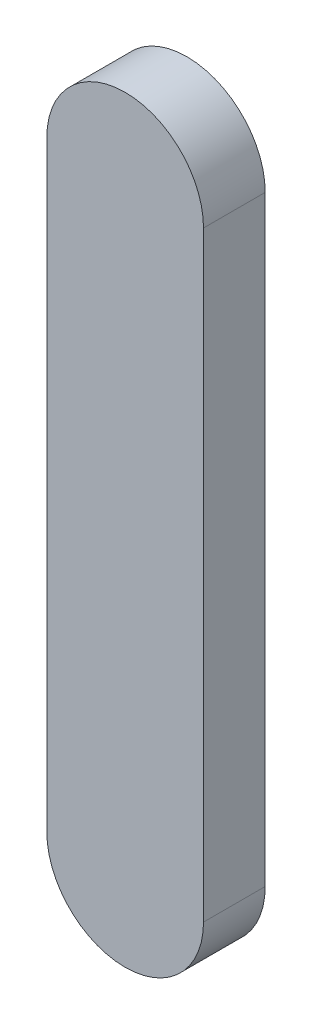
ISO-10303-21;
HEADER;
FILE_DESCRIPTION(('STEP AP214'),'2;1');
FILE_NAME('part.step','',(''),(''),'','','');
FILE_SCHEMA(('AUTOMOTIVE_DESIGN { 1 0 10303 214 1 1 1 1 }'));
ENDSEC;
DATA;
#1=APPLICATION_CONTEXT('core data for automotive mechanical design processes');
#2=APPLICATION_PROTOCOL_DEFINITION('international standard','automotive_design',2000,#1);
#3=PRODUCT_CONTEXT('',#1,'mechanical');
#4=PRODUCT('Part','Part','',(#3));
#5=PRODUCT_RELATED_PRODUCT_CATEGORY('part','',(#4));
#6=PRODUCT_DEFINITION_FORMATION('','',#4);
#7=PRODUCT_DEFINITION_CONTEXT('part definition',#1,'design');
#8=PRODUCT_DEFINITION('design','',#6,#7);
#9=PRODUCT_DEFINITION_SHAPE('','',#8);
#10=(LENGTH_UNIT() NAMED_UNIT(*) SI_UNIT(.MILLI.,.METRE.));
#11=(NAMED_UNIT(*) PLANE_ANGLE_UNIT() SI_UNIT($,.RADIAN.));
#12=(NAMED_UNIT(*) SI_UNIT($,.STERADIAN.) SOLID_ANGLE_UNIT());
#13=UNCERTAINTY_MEASURE_WITH_UNIT(LENGTH_MEASURE(1.E-05),#10,'distance_accuracy_value','');
#14=(GEOMETRIC_REPRESENTATION_CONTEXT(3) GLOBAL_UNCERTAINTY_ASSIGNED_CONTEXT((#13)) GLOBAL_UNIT_ASSIGNED_CONTEXT((#10,
#11,#12)) REPRESENTATION_CONTEXT('',''));
#15=CARTESIAN_POINT('',(0.,0.,0.));
#16=DIRECTION('',(0.,0.,1.));
#17=DIRECTION('',(1.,0.,0.));
#18=AXIS2_PLACEMENT_3D('',#15,#16,#17);
#19=CARTESIAN_POINT('',(92.202,53.97500254,0.));
#20=DIRECTION('',(-1.,0.,0.));
#21=DIRECTION('',(0.,1.,0.));
#22=AXIS2_PLACEMENT_3D('',#19,#20,#21);
#23=PLANE('',#22);
#24=DIRECTION('',(0.,1.,0.));
#25=VECTOR('',#24,1.);
#26=CARTESIAN_POINT('',(92.202,53.97500254,0.1999996));
#27=LINE('',#26,#25);
#28=CARTESIAN_POINT('',(92.202,53.97500254,0.1999996));
#29=VERTEX_POINT('',#28);
#30=CARTESIAN_POINT('',(92.202,55.92358132,0.1999996));
#31=VERTEX_POINT('',#30);
#32=EDGE_CURVE('E11',#29,#31,#27,.T.);
#33=ORIENTED_EDGE('',*,*,#32,.F.);
#34=DIRECTION('',(0.,0.,1.));
#35=VECTOR('',#34,1.);
#36=CARTESIAN_POINT('',(92.202,53.97500254,0.));
#37=LINE('',#36,#35);
#38=CARTESIAN_POINT('',(92.202,53.97500254,0.));
#39=VERTEX_POINT('',#38);
#40=EDGE_CURVE('E24',#39,#29,#37,.T.);
#41=ORIENTED_EDGE('',*,*,#40,.F.);
#42=DIRECTION('',(0.,1.,0.));
#43=VECTOR('',#42,1.);
#44=CARTESIAN_POINT('',(92.202,53.97500254,0.));
#45=LINE('',#44,#43);
#46=CARTESIAN_POINT('',(92.202,55.92358132,0.));
#47=VERTEX_POINT('',#46);
#48=EDGE_CURVE('E75',#39,#47,#45,.T.);
#49=ORIENTED_EDGE('',*,*,#48,.T.);
#50=DIRECTION('',(0.,0.,1.));
#51=VECTOR('',#50,1.);
#52=CARTESIAN_POINT('',(92.202,55.92358132,0.));
#53=LINE('',#52,#51);
#54=EDGE_CURVE('E37',#47,#31,#53,.T.);
#55=ORIENTED_EDGE('',*,*,#54,.T.);
#56=EDGE_LOOP('',(#33,#41,#49,#55));
#57=FACE_BOUND('',#56,.T.);
#58=ADVANCED_FACE('F17',(#57),#23,.F.);
#59=CARTESIAN_POINT('',(91.948,55.92358132,0.));
#60=DIRECTION('',(0.,0.,-1.));
#61=DIRECTION('',(1.,0.,0.));
#62=AXIS2_PLACEMENT_3D('',#59,#60,#61);
#63=CYLINDRICAL_SURFACE('',#62,0.253999999999998);
#64=CARTESIAN_POINT('',(91.948,55.92358132,0.1999996));
#65=DIRECTION('',(0.,0.,1.));
#66=DIRECTION('',(1.,0.,0.));
#67=AXIS2_PLACEMENT_3D('',#64,#65,#66);
#68=CIRCLE('',#67,0.253999999999998);
#69=CARTESIAN_POINT('',(91.694,55.92358132,0.1999996));
#70=VERTEX_POINT('',#69);
#71=EDGE_CURVE('E83',#31,#70,#68,.T.);
#72=ORIENTED_EDGE('',*,*,#71,.F.);
#73=ORIENTED_EDGE('',*,*,#54,.F.);
#74=CARTESIAN_POINT('',(91.948,55.92358132,0.));
#75=DIRECTION('',(0.,0.,1.));
#76=DIRECTION('',(1.,0.,0.));
#77=AXIS2_PLACEMENT_3D('',#74,#75,#76);
#78=CIRCLE('',#77,0.253999999999998);
#79=CARTESIAN_POINT('',(91.694,55.92358132,0.));
#80=VERTEX_POINT('',#79);
#81=EDGE_CURVE('E81',#47,#80,#78,.T.);
#82=ORIENTED_EDGE('',*,*,#81,.T.);
#83=DIRECTION('',(0.,0.,1.));
#84=VECTOR('',#83,1.);
#85=CARTESIAN_POINT('',(91.694,55.92358132,0.));
#86=LINE('',#85,#84);
#87=EDGE_CURVE('E67',#80,#70,#86,.T.);
#88=ORIENTED_EDGE('',*,*,#87,.T.);
#89=EDGE_LOOP('',(#72,#73,#82,#88));
#90=FACE_BOUND('',#89,.T.);
#91=ADVANCED_FACE('F89',(#90),#63,.T.);
#92=CARTESIAN_POINT('',(91.694,55.92358132,0.));
#93=DIRECTION('',(1.,0.,0.));
#94=DIRECTION('',(0.,-1.,0.));
#95=AXIS2_PLACEMENT_3D('',#92,#93,#94);
#96=PLANE('',#95);
#97=DIRECTION('',(0.,-1.,0.));
#98=VECTOR('',#97,1.);
#99=CARTESIAN_POINT('',(91.694,55.92358132,0.1999996));
#100=LINE('',#99,#98);
#101=CARTESIAN_POINT('',(91.694,53.97500254,0.1999996));
#102=VERTEX_POINT('',#101);
#103=EDGE_CURVE('E71',#70,#102,#100,.T.);
#104=ORIENTED_EDGE('',*,*,#103,.F.);
#105=ORIENTED_EDGE('',*,*,#87,.F.);
#106=DIRECTION('',(0.,-1.,0.));
#107=VECTOR('',#106,1.);
#108=CARTESIAN_POINT('',(91.694,55.92358132,0.));
#109=LINE('',#108,#107);
#110=CARTESIAN_POINT('',(91.694,53.97500254,0.));
#111=VERTEX_POINT('',#110);
#112=EDGE_CURVE('E63',#80,#111,#109,.T.);
#113=ORIENTED_EDGE('',*,*,#112,.T.);
#114=DIRECTION('',(0.,0.,1.));
#115=VECTOR('',#114,1.);
#116=CARTESIAN_POINT('',(91.694,53.97500254,0.));
#117=LINE('',#116,#115);
#118=EDGE_CURVE('E53',#111,#102,#117,.T.);
#119=ORIENTED_EDGE('',*,*,#118,.T.);
#120=EDGE_LOOP('',(#104,#105,#113,#119));
#121=FACE_BOUND('',#120,.T.);
#122=ADVANCED_FACE('F66',(#121),#96,.F.);
#123=CARTESIAN_POINT('',(91.948,53.97500254,0.));
#124=DIRECTION('',(0.,0.,-1.));
#125=DIRECTION('',(-1.,0.,0.));
#126=AXIS2_PLACEMENT_3D('',#123,#124,#125);
#127=CYLINDRICAL_SURFACE('',#126,0.253999999999998);
#128=CARTESIAN_POINT('',(91.948,53.97500254,0.1999996));
#129=DIRECTION('',(0.,0.,1.));
#130=DIRECTION('',(-1.,0.,0.));
#131=AXIS2_PLACEMENT_3D('',#128,#129,#130);
#132=CIRCLE('',#131,0.253999999999998);
#133=EDGE_CURVE('E59',#102,#29,#132,.T.);
#134=ORIENTED_EDGE('',*,*,#133,.F.);
#135=ORIENTED_EDGE('',*,*,#118,.F.);
#136=CARTESIAN_POINT('',(91.948,53.97500254,0.));
#137=DIRECTION('',(0.,0.,1.));
#138=DIRECTION('',(-1.,0.,0.));
#139=AXIS2_PLACEMENT_3D('',#136,#137,#138);
#140=CIRCLE('',#139,0.253999999999998);
#141=EDGE_CURVE('E57',#111,#39,#140,.T.);
#142=ORIENTED_EDGE('',*,*,#141,.T.);
#143=ORIENTED_EDGE('',*,*,#40,.T.);
#144=EDGE_LOOP('',(#134,#135,#142,#143));
#145=FACE_BOUND('',#144,.T.);
#146=ADVANCED_FACE('F55',(#145),#127,.T.);
#147=CARTESIAN_POINT('',(92.202,53.97500254,0.));
#148=DIRECTION('',(0.,0.,-1.));
#149=DIRECTION('',(-1.,0.,0.));
#150=AXIS2_PLACEMENT_3D('',#147,#148,#149);
#151=PLANE('',#150);
#152=ORIENTED_EDGE('',*,*,#141,.F.);
#153=ORIENTED_EDGE('',*,*,#112,.F.);
#154=ORIENTED_EDGE('',*,*,#81,.F.);
#155=ORIENTED_EDGE('',*,*,#48,.F.);
#156=EDGE_LOOP('',(#152,#153,#154,#155));
#157=FACE_BOUND('',#156,.T.);
#158=ADVANCED_FACE('F74',(#157),#151,.T.);
#159=CARTESIAN_POINT('',(92.202,53.97500254,0.1999996));
#160=DIRECTION('',(0.,0.,-1.));
#161=DIRECTION('',(-1.,0.,0.));
#162=AXIS2_PLACEMENT_3D('',#159,#160,#161);
#163=PLANE('',#162);
#164=ORIENTED_EDGE('',*,*,#32,.T.);
#165=ORIENTED_EDGE('',*,*,#71,.T.);
#166=ORIENTED_EDGE('',*,*,#103,.T.);
#167=ORIENTED_EDGE('',*,*,#133,.T.);
#168=EDGE_LOOP('',(#164,#165,#166,#167));
#169=FACE_BOUND('',#168,.T.);
#170=ADVANCED_FACE('F91',(#169),#163,.F.);
#171=CLOSED_SHELL('',(#58,#91,#122,#146,#158,#170));
#172=MANIFOLD_SOLID_BREP('B1',#171);
#173=ADVANCED_BREP_SHAPE_REPRESENTATION('',(#18,#172),#14);
#174=SHAPE_DEFINITION_REPRESENTATION(#9,#173);
ENDSEC;
END-ISO-10303-21;
